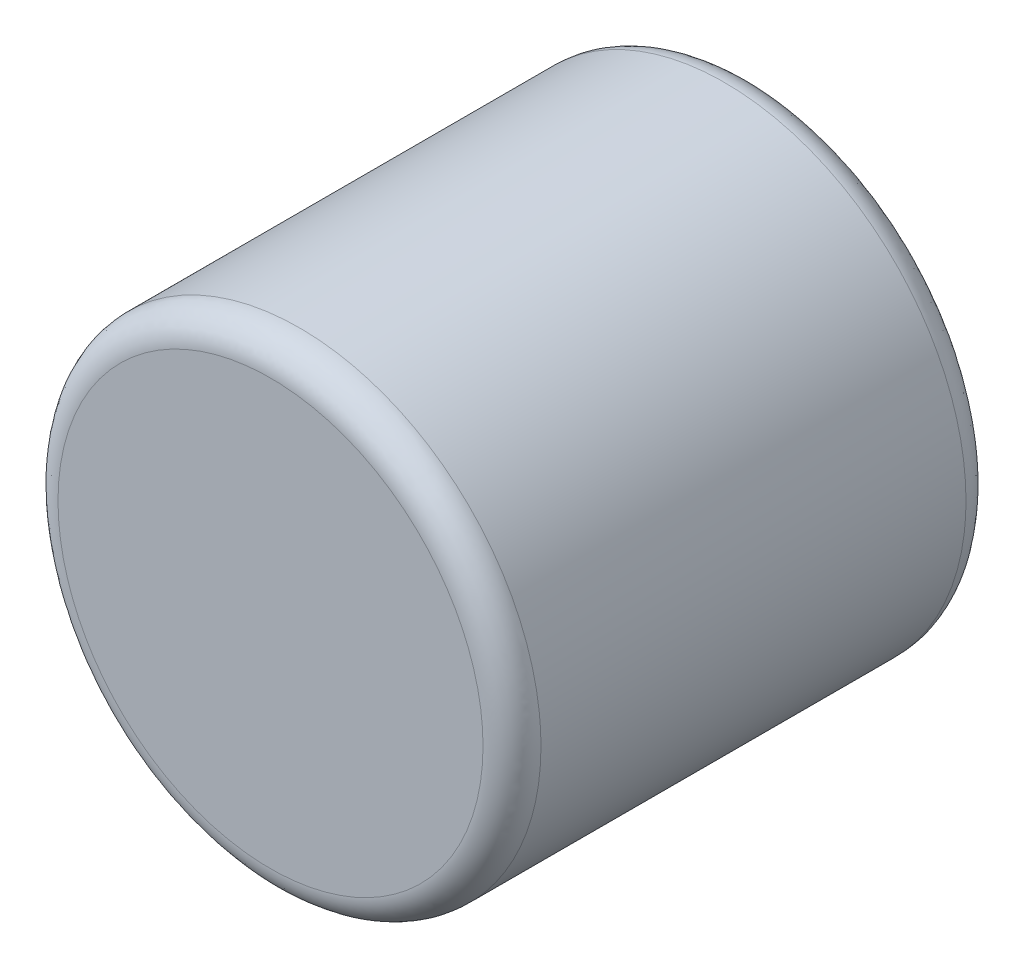
ISO-10303-21;
HEADER;
FILE_DESCRIPTION(('STEP AP214'),'2;1');
FILE_NAME('part.step','',(''),(''),'','','');
FILE_SCHEMA(('AUTOMOTIVE_DESIGN { 1 0 10303 214 1 1 1 1 }'));
ENDSEC;
DATA;
#1=APPLICATION_CONTEXT('core data for automotive mechanical design processes');
#2=APPLICATION_PROTOCOL_DEFINITION('international standard','automotive_design',2000,#1);
#3=PRODUCT_CONTEXT('',#1,'mechanical');
#4=PRODUCT('Part','Part','',(#3));
#5=PRODUCT_RELATED_PRODUCT_CATEGORY('part','',(#4));
#6=PRODUCT_DEFINITION_FORMATION('','',#4);
#7=PRODUCT_DEFINITION_CONTEXT('part definition',#1,'design');
#8=PRODUCT_DEFINITION('design','',#6,#7);
#9=PRODUCT_DEFINITION_SHAPE('','',#8);
#10=(LENGTH_UNIT() NAMED_UNIT(*) SI_UNIT(.MILLI.,.METRE.));
#11=(NAMED_UNIT(*) PLANE_ANGLE_UNIT() SI_UNIT($,.RADIAN.));
#12=(NAMED_UNIT(*) SI_UNIT($,.STERADIAN.) SOLID_ANGLE_UNIT());
#13=UNCERTAINTY_MEASURE_WITH_UNIT(LENGTH_MEASURE(1.E-05),#10,'distance_accuracy_value','');
#14=(GEOMETRIC_REPRESENTATION_CONTEXT(3) GLOBAL_UNCERTAINTY_ASSIGNED_CONTEXT((#13)) GLOBAL_UNIT_ASSIGNED_CONTEXT((#10,
#11,#12)) REPRESENTATION_CONTEXT('',''));
#15=CARTESIAN_POINT('',(0.,0.,0.));
#16=DIRECTION('',(0.,0.,1.));
#17=DIRECTION('',(1.,0.,0.));
#18=AXIS2_PLACEMENT_3D('',#15,#16,#17);
#19=CARTESIAN_POINT('',(-2.5,0.,0.3));
#20=CARTESIAN_POINT('',(-2.5,-2.5,0.3));
#21=CARTESIAN_POINT('',(0.,-2.5,0.3));
#22=CARTESIAN_POINT('',(2.5,-2.5,0.3));
#23=CARTESIAN_POINT('',(2.5,0.,0.3));
#24=CARTESIAN_POINT('',(2.5,2.5,0.3));
#25=CARTESIAN_POINT('',(0.,2.5,0.3));
#26=CARTESIAN_POINT('',(-2.5,2.5,0.3));
#27=CARTESIAN_POINT('',(-2.5,0.,0.3));
#28=CARTESIAN_POINT('',(-2.5,0.,0.));
#29=CARTESIAN_POINT('',(-2.5,-2.5,0.));
#30=CARTESIAN_POINT('',(0.,-2.5,0.));
#31=CARTESIAN_POINT('',(2.5,-2.5,0.));
#32=CARTESIAN_POINT('',(2.5,0.,0.));
#33=CARTESIAN_POINT('',(2.5,2.5,0.));
#34=CARTESIAN_POINT('',(0.,2.5,0.));
#35=CARTESIAN_POINT('',(-2.5,2.5,0.));
#36=CARTESIAN_POINT('',(-2.5,0.,0.));
#37=CARTESIAN_POINT('',(-2.2,0.,0.));
#38=CARTESIAN_POINT('',(-2.2,-2.2,0.));
#39=CARTESIAN_POINT('',(0.,-2.2,0.));
#40=CARTESIAN_POINT('',(2.2,-2.2,0.));
#41=CARTESIAN_POINT('',(2.2,0.,0.));
#42=CARTESIAN_POINT('',(2.2,2.2,0.));
#43=CARTESIAN_POINT('',(0.,2.2,0.));
#44=CARTESIAN_POINT('',(-2.2,2.2,0.));
#45=CARTESIAN_POINT('',(-2.2,0.,0.));
#46=(BOUNDED_SURFACE() B_SPLINE_SURFACE(2,2,((#19,#20,#21,#22,#23,#24,#25,#26,#27),(#28,#29,#30,
#31,#32,#33,#34,#35,#36),(#37,#38,#39,#40,#41,#42,#43,#44,#45)),.UNSPECIFIED.,.F.,.T.,
.F.) B_SPLINE_SURFACE_WITH_KNOTS((3,3),(3,2,2,2,3),(-1.5707963267949,0.),(-3.14159265358979,
-1.5707963267949,0.,1.5707963267949,3.14159265358979),
.UNSPECIFIED.) GEOMETRIC_REPRESENTATION_ITEM() RATIONAL_B_SPLINE_SURFACE(((1.,0.707106781186548,
1.,0.707106781186548,1.,0.707106781186548,1.,0.707106781186548,1.),(0.707106781186549,0.5,
0.707106781186549,0.5,0.707106781186549,0.5,0.707106781186549,0.5,0.707106781186549),(1.,
0.707106781186548,1.,0.707106781186548,1.,0.707106781186548,1.,0.707106781186548,1.))) REPRESENTATION_ITEM('') SURFACE());
#47=CARTESIAN_POINT('',(2.5,0.,0.3));
#48=CARTESIAN_POINT('',(2.5,2.5,0.3));
#49=CARTESIAN_POINT('',(0.,2.5,0.3));
#50=CARTESIAN_POINT('',(-2.5,2.5,0.3));
#51=CARTESIAN_POINT('',(-2.5,0.,0.3));
#52=(BOUNDED_CURVE() B_SPLINE_CURVE(2,(#47,#48,#49,#50,#51),.UNSPECIFIED.,.F.,
.F.) B_SPLINE_CURVE_WITH_KNOTS((3,2,3),(0.,1.5707963267949,3.14159265358979),
.UNSPECIFIED.) CURVE() GEOMETRIC_REPRESENTATION_ITEM() RATIONAL_B_SPLINE_CURVE((1.,
0.707106781186548,1.,0.707106781186548,1.)) REPRESENTATION_ITEM(''));
#53=CARTESIAN_POINT('',(2.5,0.,0.3));
#54=VERTEX_POINT('',#53);
#55=CARTESIAN_POINT('',(-2.5,0.,0.3));
#56=VERTEX_POINT('',#55);
#57=EDGE_CURVE('E62',#54,#56,#52,.T.);
#58=CARTESIAN_POINT('',(-2.5,0.,0.3));
#59=CARTESIAN_POINT('',(-2.5,-2.5,0.3));
#60=CARTESIAN_POINT('',(0.,-2.5,0.3));
#61=CARTESIAN_POINT('',(2.5,-2.5,0.3));
#62=CARTESIAN_POINT('',(2.5,0.,0.3));
#63=(BOUNDED_CURVE() B_SPLINE_CURVE(2,(#58,#59,#60,#61,#62),.UNSPECIFIED.,.F.,
.F.) B_SPLINE_CURVE_WITH_KNOTS((3,2,3),(3.14159265358979,4.71238898038469,6.28318530717959),
.UNSPECIFIED.) CURVE() GEOMETRIC_REPRESENTATION_ITEM() RATIONAL_B_SPLINE_CURVE((1.,
0.707106781186548,1.,0.707106781186547,1.)) REPRESENTATION_ITEM(''));
#64=EDGE_CURVE('E22',#56,#54,#63,.T.);
#65=CARTESIAN_POINT('',(-2.5,0.,0.3));
#66=CARTESIAN_POINT('',(-2.5,0.,0.));
#67=CARTESIAN_POINT('',(-2.2,0.,0.));
#68=(BOUNDED_CURVE() B_SPLINE_CURVE(2,(#65,#66,#67),.UNSPECIFIED.,.F.,
.F.) B_SPLINE_CURVE_WITH_KNOTS((3,3),(0.,1.5707963267949),
.UNSPECIFIED.) CURVE() GEOMETRIC_REPRESENTATION_ITEM() RATIONAL_B_SPLINE_CURVE((1.,
0.707106781186549,1.)) REPRESENTATION_ITEM(''));
#69=CARTESIAN_POINT('',(-2.2,0.,0.));
#70=VERTEX_POINT('',#69);
#71=EDGE_CURVE('E11',#56,#70,#68,.T.);
#72=CARTESIAN_POINT('',(2.2,0.,0.));
#73=CARTESIAN_POINT('',(2.2,-2.2,0.));
#74=CARTESIAN_POINT('',(0.,-2.2,0.));
#75=CARTESIAN_POINT('',(-2.2,-2.2,0.));
#76=CARTESIAN_POINT('',(-2.2,0.,0.));
#77=(BOUNDED_CURVE() B_SPLINE_CURVE(2,(#72,#73,#74,#75,#76),.UNSPECIFIED.,.F.,
.F.) B_SPLINE_CURVE_WITH_KNOTS((3,2,3),(-6.28318530717959,-4.71238898038469,-3.14159265358979),
.UNSPECIFIED.) CURVE() GEOMETRIC_REPRESENTATION_ITEM() RATIONAL_B_SPLINE_CURVE((1.,
0.707106781186548,1.,0.707106781186548,1.)) REPRESENTATION_ITEM(''));
#78=CARTESIAN_POINT('',(2.2,0.,0.));
#79=VERTEX_POINT('',#78);
#80=EDGE_CURVE('E93',#79,#70,#77,.T.);
#81=CARTESIAN_POINT('',(-2.2,0.,0.));
#82=CARTESIAN_POINT('',(-2.2,2.2,0.));
#83=CARTESIAN_POINT('',(0.,2.2,0.));
#84=CARTESIAN_POINT('',(2.2,2.2,0.));
#85=CARTESIAN_POINT('',(2.2,0.,0.));
#86=(BOUNDED_CURVE() B_SPLINE_CURVE(2,(#81,#82,#83,#84,#85),.UNSPECIFIED.,.F.,
.F.) B_SPLINE_CURVE_WITH_KNOTS((3,2,3),(-3.14159265358979,-1.5707963267949,0.),
.UNSPECIFIED.) CURVE() GEOMETRIC_REPRESENTATION_ITEM() RATIONAL_B_SPLINE_CURVE((1.,
0.707106781186547,1.,0.707106781186548,1.)) REPRESENTATION_ITEM(''));
#87=EDGE_CURVE('E85',#70,#79,#86,.T.);
#88=ORIENTED_EDGE('',*,*,#57,.F.);
#89=ORIENTED_EDGE('',*,*,#64,.F.);
#90=ORIENTED_EDGE('',*,*,#71,.T.);
#91=ORIENTED_EDGE('',*,*,#80,.F.);
#92=ORIENTED_EDGE('',*,*,#87,.F.);
#93=ORIENTED_EDGE('',*,*,#71,.F.);
#94=EDGE_LOOP('',(#88,#89,#90,#91,#92,#93));
#95=FACE_BOUND('',#94,.T.);
#96=ADVANCED_FACE('F17',(#95),#46,.T.);
#97=CARTESIAN_POINT('',(-2.2,0.,5.));
#98=CARTESIAN_POINT('',(-2.2,-2.2,5.));
#99=CARTESIAN_POINT('',(0.,-2.2,5.));
#100=CARTESIAN_POINT('',(2.2,-2.2,5.));
#101=CARTESIAN_POINT('',(2.2,0.,5.));
#102=CARTESIAN_POINT('',(2.2,2.2,5.));
#103=CARTESIAN_POINT('',(0.,2.2,5.));
#104=CARTESIAN_POINT('',(-2.2,2.2,5.));
#105=CARTESIAN_POINT('',(-2.2,0.,5.));
#106=CARTESIAN_POINT('',(-2.5,0.,5.));
#107=CARTESIAN_POINT('',(-2.5,-2.5,5.));
#108=CARTESIAN_POINT('',(0.,-2.5,5.));
#109=CARTESIAN_POINT('',(2.5,-2.5,5.));
#110=CARTESIAN_POINT('',(2.5,0.,5.));
#111=CARTESIAN_POINT('',(2.5,2.5,5.));
#112=CARTESIAN_POINT('',(0.,2.5,5.));
#113=CARTESIAN_POINT('',(-2.5,2.5,5.));
#114=CARTESIAN_POINT('',(-2.5,0.,5.));
#115=CARTESIAN_POINT('',(-2.5,0.,4.7));
#116=CARTESIAN_POINT('',(-2.5,-2.5,4.7));
#117=CARTESIAN_POINT('',(0.,-2.5,4.7));
#118=CARTESIAN_POINT('',(2.5,-2.5,4.7));
#119=CARTESIAN_POINT('',(2.5,0.,4.7));
#120=CARTESIAN_POINT('',(2.5,2.5,4.7));
#121=CARTESIAN_POINT('',(0.,2.5,4.7));
#122=CARTESIAN_POINT('',(-2.5,2.5,4.7));
#123=CARTESIAN_POINT('',(-2.5,0.,4.7));
#124=(BOUNDED_SURFACE() B_SPLINE_SURFACE(2,2,((#97,#98,#99,#100,#101,#102,#103,#104,#105),(#106,
#107,#108,#109,#110,#111,#112,#113,#114),(#115,#116,#117,#118,#119,#120,#121,#122,#123)),
.UNSPECIFIED.,.F.,.T.,.F.) B_SPLINE_SURFACE_WITH_KNOTS((3,3),(3,2,2,2,3),(0.,1.5707963267949),
(-3.14159265358979,-1.5707963267949,0.,1.5707963267949,3.14159265358979),
.UNSPECIFIED.) GEOMETRIC_REPRESENTATION_ITEM() RATIONAL_B_SPLINE_SURFACE(((1.,0.707106781186548,
1.,0.707106781186548,1.,0.707106781186548,1.,0.707106781186548,1.),(0.707106781186552,0.5,
0.707106781186552,0.5,0.707106781186552,0.5,0.707106781186552,0.5,0.707106781186552),(1.,
0.707106781186548,1.,0.707106781186548,1.,0.707106781186548,1.,0.707106781186548,1.))) REPRESENTATION_ITEM('') SURFACE());
#125=CARTESIAN_POINT('',(2.2,0.,5.));
#126=CARTESIAN_POINT('',(2.2,2.2,5.));
#127=CARTESIAN_POINT('',(0.,2.2,5.));
#128=CARTESIAN_POINT('',(-2.2,2.2,5.));
#129=CARTESIAN_POINT('',(-2.2,0.,5.));
#130=(BOUNDED_CURVE() B_SPLINE_CURVE(2,(#125,#126,#127,#128,#129),.UNSPECIFIED.,.F.,
.F.) B_SPLINE_CURVE_WITH_KNOTS((3,2,3),(0.,1.5707963267949,3.14159265358979),
.UNSPECIFIED.) CURVE() GEOMETRIC_REPRESENTATION_ITEM() RATIONAL_B_SPLINE_CURVE((1.,
0.707106781186548,1.,0.707106781186547,1.)) REPRESENTATION_ITEM(''));
#131=CARTESIAN_POINT('',(2.2,0.,5.));
#132=VERTEX_POINT('',#131);
#133=CARTESIAN_POINT('',(-2.2,0.,5.));
#134=VERTEX_POINT('',#133);
#135=EDGE_CURVE('E121',#132,#134,#130,.T.);
#136=CARTESIAN_POINT('',(-2.2,0.,5.));
#137=CARTESIAN_POINT('',(-2.2,-2.2,5.));
#138=CARTESIAN_POINT('',(0.,-2.2,5.));
#139=CARTESIAN_POINT('',(2.2,-2.2,5.));
#140=CARTESIAN_POINT('',(2.2,0.,5.));
#141=(BOUNDED_CURVE() B_SPLINE_CURVE(2,(#136,#137,#138,#139,#140),.UNSPECIFIED.,.F.,
.F.) B_SPLINE_CURVE_WITH_KNOTS((3,2,3),(3.14159265358979,4.71238898038469,6.28318530717959),
.UNSPECIFIED.) CURVE() GEOMETRIC_REPRESENTATION_ITEM() RATIONAL_B_SPLINE_CURVE((1.,
0.707106781186548,1.,0.707106781186548,1.)) REPRESENTATION_ITEM(''));
#142=EDGE_CURVE('E101',#134,#132,#141,.T.);
#143=CARTESIAN_POINT('',(-2.2,0.,5.));
#144=CARTESIAN_POINT('',(-2.5,0.,5.));
#145=CARTESIAN_POINT('',(-2.5,0.,4.7));
#146=(BOUNDED_CURVE() B_SPLINE_CURVE(2,(#143,#144,#145),.UNSPECIFIED.,.F.,
.F.) B_SPLINE_CURVE_WITH_KNOTS((3,3),(-1.5707963267949,0.),
.UNSPECIFIED.) CURVE() GEOMETRIC_REPRESENTATION_ITEM() RATIONAL_B_SPLINE_CURVE((1.,
0.707106781186552,1.)) REPRESENTATION_ITEM(''));
#147=CARTESIAN_POINT('',(-2.5,0.,4.7));
#148=VERTEX_POINT('',#147);
#149=EDGE_CURVE('E31',#134,#148,#146,.T.);
#150=CARTESIAN_POINT('',(2.5,0.,4.7));
#151=CARTESIAN_POINT('',(2.5,-2.5,4.7));
#152=CARTESIAN_POINT('',(0.,-2.5,4.7));
#153=CARTESIAN_POINT('',(-2.5,-2.5,4.7));
#154=CARTESIAN_POINT('',(-2.5,0.,4.7));
#155=(BOUNDED_CURVE() B_SPLINE_CURVE(2,(#150,#151,#152,#153,#154),.UNSPECIFIED.,.F.,
.F.) B_SPLINE_CURVE_WITH_KNOTS((3,2,3),(-6.28318530717959,-4.71238898038469,-3.14159265358979),
.UNSPECIFIED.) CURVE() GEOMETRIC_REPRESENTATION_ITEM() RATIONAL_B_SPLINE_CURVE((1.,
0.707106781186547,1.,0.707106781186548,1.)) REPRESENTATION_ITEM(''));
#156=CARTESIAN_POINT('',(2.5,0.,4.7));
#157=VERTEX_POINT('',#156);
#158=EDGE_CURVE('E68',#157,#148,#155,.T.);
#159=CARTESIAN_POINT('',(-2.5,0.,4.7));
#160=CARTESIAN_POINT('',(-2.5,2.5,4.7));
#161=CARTESIAN_POINT('',(0.,2.5,4.7));
#162=CARTESIAN_POINT('',(2.5,2.5,4.7));
#163=CARTESIAN_POINT('',(2.5,0.,4.7));
#164=(BOUNDED_CURVE() B_SPLINE_CURVE(2,(#159,#160,#161,#162,#163),.UNSPECIFIED.,.F.,
.F.) B_SPLINE_CURVE_WITH_KNOTS((3,2,3),(-3.14159265358979,-1.5707963267949,0.),
.UNSPECIFIED.) CURVE() GEOMETRIC_REPRESENTATION_ITEM() RATIONAL_B_SPLINE_CURVE((1.,
0.707106781186548,1.,0.707106781186548,1.)) REPRESENTATION_ITEM(''));
#165=EDGE_CURVE('E65',#148,#157,#164,.T.);
#166=ORIENTED_EDGE('',*,*,#135,.F.);
#167=ORIENTED_EDGE('',*,*,#142,.F.);
#168=ORIENTED_EDGE('',*,*,#149,.T.);
#169=ORIENTED_EDGE('',*,*,#158,.F.);
#170=ORIENTED_EDGE('',*,*,#165,.F.);
#171=ORIENTED_EDGE('',*,*,#149,.F.);
#172=EDGE_LOOP('',(#166,#167,#168,#169,#170,#171));
#173=FACE_BOUND('',#172,.T.);
#174=ADVANCED_FACE('F150',(#173),#124,.T.);
#175=CARTESIAN_POINT('',(2.64,-2.64,0.));
#176=CARTESIAN_POINT('',(2.64,2.64,0.));
#177=CARTESIAN_POINT('',(-2.64,-2.64,0.));
#178=CARTESIAN_POINT('',(-2.64,2.64,0.));
#179=(BOUNDED_SURFACE() B_SPLINE_SURFACE(1,1,((#175,#176),(#177,#178)),.UNSPECIFIED.,.F.,.F.,
.F.) B_SPLINE_SURFACE_WITH_KNOTS((2,2),(2,2),(-0.00264,0.00264),(-0.00264,0.00264),
.UNSPECIFIED.) GEOMETRIC_REPRESENTATION_ITEM() RATIONAL_B_SPLINE_SURFACE(((1.,1.),(1.,1.))) REPRESENTATION_ITEM('') SURFACE());
#180=ORIENTED_EDGE('',*,*,#80,.T.);
#181=ORIENTED_EDGE('',*,*,#87,.T.);
#182=EDGE_LOOP('',(#180,#181));
#183=FACE_BOUND('',#182,.T.);
#184=ADVANCED_FACE('F155',(#183),#179,.T.);
#185=CARTESIAN_POINT('',(-2.64,-2.64,5.));
#186=CARTESIAN_POINT('',(-2.64,2.64,5.));
#187=CARTESIAN_POINT('',(2.64,-2.64,5.));
#188=CARTESIAN_POINT('',(2.64,2.64,5.));
#189=(BOUNDED_SURFACE() B_SPLINE_SURFACE(1,1,((#185,#186),(#187,#188)),.UNSPECIFIED.,.F.,.F.,
.F.) B_SPLINE_SURFACE_WITH_KNOTS((2,2),(2,2),(-0.00264,0.00264),(-0.00264,0.00264),
.UNSPECIFIED.) GEOMETRIC_REPRESENTATION_ITEM() RATIONAL_B_SPLINE_SURFACE(((1.,1.),(1.,1.))) REPRESENTATION_ITEM('') SURFACE());
#190=ORIENTED_EDGE('',*,*,#135,.T.);
#191=ORIENTED_EDGE('',*,*,#142,.T.);
#192=EDGE_LOOP('',(#190,#191));
#193=FACE_BOUND('',#192,.T.);
#194=ADVANCED_FACE('F153',(#193),#189,.T.);
#195=CARTESIAN_POINT('',(2.5,0.,0.3));
#196=CARTESIAN_POINT('',(2.5,-2.5,0.3));
#197=CARTESIAN_POINT('',(0.,-2.5,0.3));
#198=CARTESIAN_POINT('',(-2.5,-2.5,0.3));
#199=CARTESIAN_POINT('',(-2.5,0.,0.3));
#200=CARTESIAN_POINT('',(-2.5,2.5,0.3));
#201=CARTESIAN_POINT('',(0.,2.5,0.3));
#202=CARTESIAN_POINT('',(2.5,2.5,0.3));
#203=CARTESIAN_POINT('',(2.5,0.,0.3));
#204=CARTESIAN_POINT('',(2.5,0.,4.7));
#205=CARTESIAN_POINT('',(2.5,-2.5,4.7));
#206=CARTESIAN_POINT('',(0.,-2.5,4.7));
#207=CARTESIAN_POINT('',(-2.5,-2.5,4.7));
#208=CARTESIAN_POINT('',(-2.5,0.,4.7));
#209=CARTESIAN_POINT('',(-2.5,2.5,4.7));
#210=CARTESIAN_POINT('',(0.,2.5,4.7));
#211=CARTESIAN_POINT('',(2.5,2.5,4.7));
#212=CARTESIAN_POINT('',(2.5,0.,4.7));
#213=(BOUNDED_SURFACE() B_SPLINE_SURFACE(1,2,((#195,#196,#197,#198,#199,#200,#201,#202,#203),
(#204,#205,#206,#207,#208,#209,#210,#211,#212)),.UNSPECIFIED.,.F.,.T.,
.F.) B_SPLINE_SURFACE_WITH_KNOTS((2,2),(3,2,2,2,3),(0.12,1.88),(-3.14159265358979,
-1.5707963267949,0.,1.5707963267949,3.14159265358979),
.UNSPECIFIED.) GEOMETRIC_REPRESENTATION_ITEM() RATIONAL_B_SPLINE_SURFACE(((1.,0.707106781186548,
1.,0.707106781186548,1.,0.707106781186548,1.,0.707106781186548,1.),(1.,0.707106781186548,1.,
0.707106781186548,1.,0.707106781186548,1.,0.707106781186548,1.))) REPRESENTATION_ITEM('') SURFACE());
#214=CARTESIAN_POINT('',(2.5,0.,0.3));
#215=CARTESIAN_POINT('',(2.5,0.,4.7));
#216=(BOUNDED_CURVE() B_SPLINE_CURVE(1,(#214,#215),.UNSPECIFIED.,.F.,
.F.) B_SPLINE_CURVE_WITH_KNOTS((2,2),(-1.88,-0.12),
.UNSPECIFIED.) CURVE() GEOMETRIC_REPRESENTATION_ITEM() RATIONAL_B_SPLINE_CURVE((1.,1.)) REPRESENTATION_ITEM(''));
#217=EDGE_CURVE('E59',#54,#157,#216,.T.);
#218=ORIENTED_EDGE('',*,*,#57,.T.);
#219=ORIENTED_EDGE('',*,*,#64,.T.);
#220=ORIENTED_EDGE('',*,*,#217,.T.);
#221=ORIENTED_EDGE('',*,*,#158,.T.);
#222=ORIENTED_EDGE('',*,*,#165,.T.);
#223=ORIENTED_EDGE('',*,*,#217,.F.);
#224=EDGE_LOOP('',(#218,#219,#220,#221,#222,#223));
#225=FACE_BOUND('',#224,.T.);
#226=ADVANCED_FACE('F61',(#225),#213,.T.);
#227=CLOSED_SHELL('',(#96,#174,#184,#194,#226));
#228=MANIFOLD_SOLID_BREP('B1',#227);
#229=ADVANCED_BREP_SHAPE_REPRESENTATION('',(#18,#228),#14);
#230=SHAPE_DEFINITION_REPRESENTATION(#9,#229);
ENDSEC;
END-ISO-10303-21;
